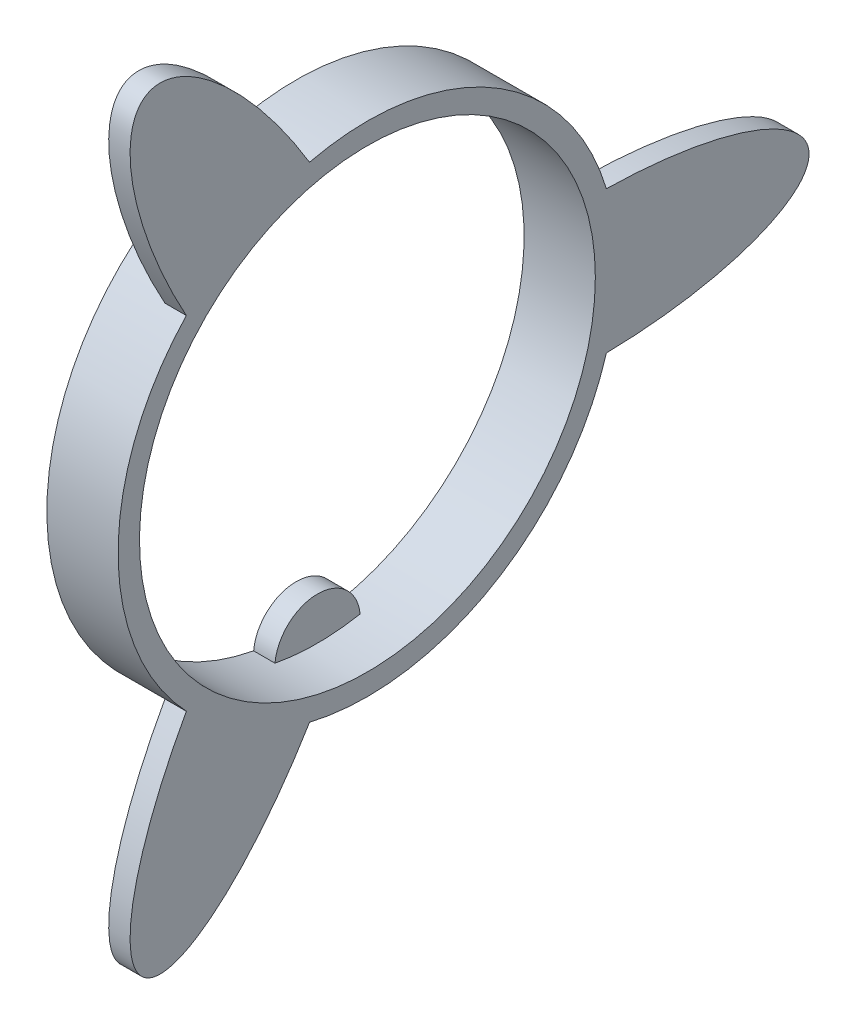
ISO-10303-21;
HEADER;
FILE_DESCRIPTION(('STEP AP214'),'2;1');
FILE_NAME('part.step','',(''),(''),'','','');
FILE_SCHEMA(('AUTOMOTIVE_DESIGN { 1 0 10303 214 1 1 1 1 }'));
ENDSEC;
DATA;
#1=APPLICATION_CONTEXT('core data for automotive mechanical design processes');
#2=APPLICATION_PROTOCOL_DEFINITION('international standard','automotive_design',2000,#1);
#3=PRODUCT_CONTEXT('',#1,'mechanical');
#4=PRODUCT('Part','Part','',(#3));
#5=PRODUCT_RELATED_PRODUCT_CATEGORY('part','',(#4));
#6=PRODUCT_DEFINITION_FORMATION('','',#4);
#7=PRODUCT_DEFINITION_CONTEXT('part definition',#1,'design');
#8=PRODUCT_DEFINITION('design','',#6,#7);
#9=PRODUCT_DEFINITION_SHAPE('','',#8);
#10=(LENGTH_UNIT() NAMED_UNIT(*) SI_UNIT(.MILLI.,.METRE.));
#11=(NAMED_UNIT(*) PLANE_ANGLE_UNIT() SI_UNIT($,.RADIAN.));
#12=(NAMED_UNIT(*) SI_UNIT($,.STERADIAN.) SOLID_ANGLE_UNIT());
#13=UNCERTAINTY_MEASURE_WITH_UNIT(LENGTH_MEASURE(1.E-05),#10,'distance_accuracy_value','');
#14=(GEOMETRIC_REPRESENTATION_CONTEXT(3) GLOBAL_UNCERTAINTY_ASSIGNED_CONTEXT((#13)) GLOBAL_UNIT_ASSIGNED_CONTEXT((#10,
#11,#12)) REPRESENTATION_CONTEXT('',''));
#15=CARTESIAN_POINT('',(0.,0.,0.));
#16=DIRECTION('',(0.,0.,1.));
#17=DIRECTION('',(1.,0.,0.));
#18=AXIS2_PLACEMENT_3D('',#15,#16,#17);
#19=CARTESIAN_POINT('',(5.,0.,0.));
#20=DIRECTION('',(-1.,0.,0.));
#21=DIRECTION('',(0.,0.,1.));
#22=AXIS2_PLACEMENT_3D('',#19,#20,#21);
#23=CYLINDRICAL_SURFACE('',#22,17.5);
#24=CARTESIAN_POINT('',(0.,0.,0.));
#25=DIRECTION('',(1.,0.,0.));
#26=DIRECTION('',(0.,0.,-1.));
#27=AXIS2_PLACEMENT_3D('',#24,#25,#26);
#28=CIRCLE('',#27,17.5);
#29=CARTESIAN_POINT('',(0.,0.,-17.5));
#30=VERTEX_POINT('',#29);
#31=EDGE_CURVE('E138',#30,#30,#28,.T.);
#32=ORIENTED_EDGE('',*,*,#31,.T.);
#33=EDGE_LOOP('',(#32));
#34=FACE_BOUND('',#33,.T.);
#35=CARTESIAN_POINT('',(3.5,0.,0.));
#36=DIRECTION('',(1.,0.,0.));
#37=DIRECTION('',(0.,0.,-1.));
#38=AXIS2_PLACEMENT_3D('',#35,#36,#37);
#39=CIRCLE('',#38,17.5);
#40=CARTESIAN_POINT('',(3.5,-12.0287168054307,12.7106243754879));
#41=VERTEX_POINT('',#40);
#42=CARTESIAN_POINT('',(3.5,-17.0220820098497,4.06186214068753));
#43=VERTEX_POINT('',#42);
#44=EDGE_CURVE('E165',#41,#43,#39,.T.);
#45=ORIENTED_EDGE('',*,*,#44,.F.);
#46=DIRECTION('',(1.,0.,0.));
#47=VECTOR('',#46,1.);
#48=CARTESIAN_POINT('',(3.5,-12.0287168054307,12.7106243754879));
#49=LINE('',#48,#47);
#50=CARTESIAN_POINT('',(5.,-12.0287168054307,12.7106243754879));
#51=VERTEX_POINT('',#50);
#52=EDGE_CURVE('E174',#41,#51,#49,.T.);
#53=ORIENTED_EDGE('',*,*,#52,.T.);
#54=CARTESIAN_POINT('',(5.,0.,0.));
#55=DIRECTION('',(1.,0.,0.));
#56=DIRECTION('',(0.,0.,-1.));
#57=AXIS2_PLACEMENT_3D('',#54,#55,#56);
#58=CIRCLE('',#57,17.5);
#59=CARTESIAN_POINT('',(5.,12.0287168054307,12.7106243754879));
#60=VERTEX_POINT('',#59);
#61=EDGE_CURVE('E143',#60,#51,#58,.T.);
#62=ORIENTED_EDGE('',*,*,#61,.F.);
#63=DIRECTION('',(1.,0.,0.));
#64=VECTOR('',#63,1.);
#65=CARTESIAN_POINT('',(3.5,12.0287168054307,12.7106243754879));
#66=LINE('',#65,#64);
#67=CARTESIAN_POINT('',(3.5,12.0287168054307,12.7106243754879));
#68=VERTEX_POINT('',#67);
#69=EDGE_CURVE('E253',#68,#60,#66,.T.);
#70=ORIENTED_EDGE('',*,*,#69,.F.);
#71=CARTESIAN_POINT('',(3.5,0.,0.));
#72=DIRECTION('',(1.,0.,0.));
#73=DIRECTION('',(0.,0.,-1.));
#74=AXIS2_PLACEMENT_3D('',#71,#72,#73);
#75=CIRCLE('',#74,17.5);
#76=CARTESIAN_POINT('',(3.5,17.0220820098497,4.06186214068754));
#77=VERTEX_POINT('',#76);
#78=EDGE_CURVE('E215',#77,#68,#75,.T.);
#79=ORIENTED_EDGE('',*,*,#78,.F.);
#80=DIRECTION('',(1.,0.,0.));
#81=VECTOR('',#80,1.);
#82=CARTESIAN_POINT('',(3.5,17.0220820098497,4.06186214068754));
#83=LINE('',#82,#81);
#84=CARTESIAN_POINT('',(5.,17.0220820098497,4.06186214068754));
#85=VERTEX_POINT('',#84);
#86=EDGE_CURVE('E140',#77,#85,#83,.T.);
#87=ORIENTED_EDGE('',*,*,#86,.T.);
#88=CARTESIAN_POINT('',(5.,4.99336520441905,-16.7724865161757));
#89=VERTEX_POINT('',#88);
#90=EDGE_CURVE('E147',#89,#85,#58,.T.);
#91=ORIENTED_EDGE('',*,*,#90,.F.);
#92=DIRECTION('',(1.,0.,0.));
#93=VECTOR('',#92,1.);
#94=CARTESIAN_POINT('',(3.5,4.99336520441905,-16.7724865161757));
#95=LINE('',#94,#93);
#96=CARTESIAN_POINT('',(3.5,4.99336520441905,-16.7724865161757));
#97=VERTEX_POINT('',#96);
#98=EDGE_CURVE('E206',#97,#89,#95,.T.);
#99=ORIENTED_EDGE('',*,*,#98,.F.);
#100=CARTESIAN_POINT('',(3.5,0.,0.));
#101=DIRECTION('',(1.,0.,0.));
#102=DIRECTION('',(0.,0.,-1.));
#103=AXIS2_PLACEMENT_3D('',#100,#101,#102);
#104=CIRCLE('',#103,17.5);
#105=CARTESIAN_POINT('',(3.5,-4.99336520441905,-16.7724865161757));
#106=VERTEX_POINT('',#105);
#107=EDGE_CURVE('E201',#106,#97,#104,.T.);
#108=ORIENTED_EDGE('',*,*,#107,.F.);
#109=DIRECTION('',(1.,0.,0.));
#110=VECTOR('',#109,1.);
#111=CARTESIAN_POINT('',(3.5,-4.99336520441905,-16.7724865161757));
#112=LINE('',#111,#110);
#113=CARTESIAN_POINT('',(5.,-4.99336520441905,-16.7724865161757));
#114=VERTEX_POINT('',#113);
#115=EDGE_CURVE('E200',#106,#114,#112,.T.);
#116=ORIENTED_EDGE('',*,*,#115,.T.);
#117=CARTESIAN_POINT('',(5.,-17.0220820098497,4.06186214068753));
#118=VERTEX_POINT('',#117);
#119=EDGE_CURVE('E146',#118,#114,#58,.T.);
#120=ORIENTED_EDGE('',*,*,#119,.F.);
#121=DIRECTION('',(1.,0.,0.));
#122=VECTOR('',#121,1.);
#123=CARTESIAN_POINT('',(3.5,-17.0220820098497,4.06186214068753));
#124=LINE('',#123,#122);
#125=EDGE_CURVE('E205',#43,#118,#124,.T.);
#126=ORIENTED_EDGE('',*,*,#125,.F.);
#127=EDGE_LOOP('',(#45,#53,#62,#70,#79,#87,#91,#99,#108,#116,#120,#126));
#128=FACE_BOUND('',#127,.T.);
#129=ADVANCED_FACE('F40',(#34,#128),#23,.T.);
#130=CARTESIAN_POINT('',(5.,0.,0.));
#131=DIRECTION('',(1.,0.,0.));
#132=DIRECTION('',(0.,0.,-1.));
#133=AXIS2_PLACEMENT_3D('',#130,#131,#132);
#134=PLANE('',#133);
#135=ORIENTED_EDGE('',*,*,#61,.T.);
#136=CARTESIAN_POINT('',(5.,-13.8564064605511,7.99999999999987));
#137=DIRECTION('',(1.,0.,0.));
#138=DIRECTION('',(0.,0.866025403784443,-0.499999999999992));
#139=AXIS2_PLACEMENT_3D('',#136,#137,#138);
#140=ELLIPSE('',#139,15.,5.);
#141=EDGE_CURVE('E62',#51,#118,#140,.T.);
#142=ORIENTED_EDGE('',*,*,#141,.T.);
#143=ORIENTED_EDGE('',*,*,#119,.T.);
#144=CARTESIAN_POINT('',(5.,0.,-16.));
#145=DIRECTION('',(1.,0.,0.));
#146=DIRECTION('',(0.,0.,1.));
#147=AXIS2_PLACEMENT_3D('',#144,#145,#146);
#148=ELLIPSE('',#147,15.,5.);
#149=EDGE_CURVE('E203',#114,#89,#148,.T.);
#150=ORIENTED_EDGE('',*,*,#149,.T.);
#151=ORIENTED_EDGE('',*,*,#90,.T.);
#152=CARTESIAN_POINT('',(5.,13.8564064605511,7.99999999999987));
#153=DIRECTION('',(-1.,0.,0.));
#154=DIRECTION('',(0.,-0.866025403784443,-0.499999999999992));
#155=AXIS2_PLACEMENT_3D('',#152,#153,#154);
#156=ELLIPSE('',#155,15.,5.);
#157=EDGE_CURVE('E209',#60,#85,#156,.T.);
#158=ORIENTED_EDGE('',*,*,#157,.F.);
#159=EDGE_LOOP('',(#135,#142,#143,#150,#151,#158));
#160=FACE_BOUND('',#159,.T.);
#161=CARTESIAN_POINT('',(5.,0.,0.));
#162=DIRECTION('',(1.,0.,0.));
#163=DIRECTION('',(0.,0.,-1.));
#164=AXIS2_PLACEMENT_3D('',#161,#162,#163);
#165=CIRCLE('',#164,16.);
#166=CARTESIAN_POINT('',(5.,0.,-16.));
#167=VERTEX_POINT('',#166);
#168=EDGE_CURVE('E134',#167,#167,#165,.T.);
#169=ORIENTED_EDGE('',*,*,#168,.F.);
#170=EDGE_LOOP('',(#169));
#171=FACE_BOUND('',#170,.T.);
#172=ADVANCED_FACE('F223',(#160,#171),#134,.T.);
#173=CARTESIAN_POINT('',(0.,0.,0.));
#174=DIRECTION('',(1.,0.,0.));
#175=DIRECTION('',(0.,0.,-1.));
#176=AXIS2_PLACEMENT_3D('',#173,#174,#175);
#177=PLANE('',#176);
#178=CARTESIAN_POINT('',(0.,-16.,0.));
#179=DIRECTION('',(-1.,0.,0.));
#180=DIRECTION('',(0.,0.,1.));
#181=AXIS2_PLACEMENT_3D('',#178,#179,#180);
#182=CIRCLE('',#181,3.);
#183=CARTESIAN_POINT('',(0.,-15.71875,2.98678731038887));
#184=VERTEX_POINT('',#183);
#185=CARTESIAN_POINT('',(0.,-15.71875,-2.98678731038887));
#186=VERTEX_POINT('',#185);
#187=EDGE_CURVE('E115',#184,#186,#182,.T.);
#188=ORIENTED_EDGE('',*,*,#187,.T.);
#189=CARTESIAN_POINT('',(0.,0.,0.));
#190=DIRECTION('',(1.,0.,0.));
#191=DIRECTION('',(0.,0.,-1.));
#192=AXIS2_PLACEMENT_3D('',#189,#190,#191);
#193=CIRCLE('',#192,16.);
#194=CARTESIAN_POINT('',(0.,15.71875,-2.98678731038887));
#195=VERTEX_POINT('',#194);
#196=EDGE_CURVE('E135',#186,#195,#193,.T.);
#197=ORIENTED_EDGE('',*,*,#196,.T.);
#198=CARTESIAN_POINT('',(0.,16.,0.));
#199=DIRECTION('',(-1.,0.,0.));
#200=DIRECTION('',(0.,0.,-1.));
#201=AXIS2_PLACEMENT_3D('',#198,#199,#200);
#202=CIRCLE('',#201,3.);
#203=CARTESIAN_POINT('',(0.,15.71875,2.98678731038887));
#204=VERTEX_POINT('',#203);
#205=EDGE_CURVE('E54',#195,#204,#202,.T.);
#206=ORIENTED_EDGE('',*,*,#205,.T.);
#207=EDGE_CURVE('E130',#204,#184,#193,.T.);
#208=ORIENTED_EDGE('',*,*,#207,.T.);
#209=EDGE_LOOP('',(#188,#197,#206,#208));
#210=FACE_BOUND('',#209,.T.);
#211=ORIENTED_EDGE('',*,*,#31,.F.);
#212=EDGE_LOOP('',(#211));
#213=FACE_BOUND('',#212,.T.);
#214=ADVANCED_FACE('F132',(#210,#213),#177,.F.);
#215=CARTESIAN_POINT('',(5.,0.,0.));
#216=DIRECTION('',(-1.,0.,0.));
#217=DIRECTION('',(0.,0.,1.));
#218=AXIS2_PLACEMENT_3D('',#215,#216,#217);
#219=CYLINDRICAL_SURFACE('',#218,16.);
#220=DIRECTION('',(-1.,0.,0.));
#221=VECTOR('',#220,1.);
#222=CARTESIAN_POINT('',(0.75,-15.71875,2.98678731038887));
#223=LINE('',#222,#221);
#224=CARTESIAN_POINT('',(1.5,-15.71875,2.98678731038887));
#225=VERTEX_POINT('',#224);
#226=EDGE_CURVE('E11',#184,#225,#223,.F.);
#227=ORIENTED_EDGE('',*,*,#226,.F.);
#228=ORIENTED_EDGE('',*,*,#207,.F.);
#229=DIRECTION('',(-1.,0.,0.));
#230=VECTOR('',#229,1.);
#231=CARTESIAN_POINT('',(0.75,15.71875,2.98678731038887));
#232=LINE('',#231,#230);
#233=CARTESIAN_POINT('',(1.5,15.71875,2.98678731038887));
#234=VERTEX_POINT('',#233);
#235=EDGE_CURVE('E151',#234,#204,#232,.T.);
#236=ORIENTED_EDGE('',*,*,#235,.F.);
#237=CARTESIAN_POINT('',(1.5,0.,0.));
#238=DIRECTION('',(1.,0.,0.));
#239=DIRECTION('',(0.,0.,-1.));
#240=AXIS2_PLACEMENT_3D('',#237,#238,#239);
#241=CIRCLE('',#240,16.);
#242=CARTESIAN_POINT('',(1.5,15.71875,-2.98678731038887));
#243=VERTEX_POINT('',#242);
#244=EDGE_CURVE('E145',#243,#234,#241,.T.);
#245=ORIENTED_EDGE('',*,*,#244,.F.);
#246=DIRECTION('',(-1.,0.,0.));
#247=VECTOR('',#246,1.);
#248=CARTESIAN_POINT('',(0.75,15.71875,-2.98678731038887));
#249=LINE('',#248,#247);
#250=EDGE_CURVE('E153',#195,#243,#249,.F.);
#251=ORIENTED_EDGE('',*,*,#250,.F.);
#252=ORIENTED_EDGE('',*,*,#196,.F.);
#253=DIRECTION('',(-1.,0.,0.));
#254=VECTOR('',#253,1.);
#255=CARTESIAN_POINT('',(0.75,-15.71875,-2.98678731038887));
#256=LINE('',#255,#254);
#257=CARTESIAN_POINT('',(1.5,-15.71875,-2.98678731038887));
#258=VERTEX_POINT('',#257);
#259=EDGE_CURVE('E47',#258,#186,#256,.T.);
#260=ORIENTED_EDGE('',*,*,#259,.F.);
#261=CARTESIAN_POINT('',(1.5,0.,0.));
#262=DIRECTION('',(-1.,0.,0.));
#263=DIRECTION('',(0.,0.,1.));
#264=AXIS2_PLACEMENT_3D('',#261,#262,#263);
#265=CIRCLE('',#264,16.);
#266=EDGE_CURVE('E131',#258,#225,#265,.T.);
#267=ORIENTED_EDGE('',*,*,#266,.T.);
#268=EDGE_LOOP('',(#227,#228,#236,#245,#251,#252,#260,#267));
#269=FACE_BOUND('',#268,.T.);
#270=ORIENTED_EDGE('',*,*,#168,.T.);
#271=EDGE_LOOP('',(#270));
#272=FACE_BOUND('',#271,.T.);
#273=ADVANCED_FACE('F127',(#269,#272),#219,.F.);
#274=CARTESIAN_POINT('',(3.5,13.8564064605511,7.99999999999987));
#275=DIRECTION('',(-1.,0.,0.));
#276=DIRECTION('',(0.,-0.866025403784443,-0.499999999999992));
#277=AXIS2_PLACEMENT_3D('',#274,#275,#276);
#278=ELLIPSE('',#277,15.,5.);
#279=DIRECTION('',(1.,0.,0.));
#280=VECTOR('',#279,1.);
#281=SURFACE_OF_LINEAR_EXTRUSION('',#278,#280);
#282=ORIENTED_EDGE('',*,*,#157,.T.);
#283=ORIENTED_EDGE('',*,*,#86,.F.);
#284=EDGE_CURVE('E212',#68,#77,#278,.T.);
#285=ORIENTED_EDGE('',*,*,#284,.F.);
#286=ORIENTED_EDGE('',*,*,#69,.T.);
#287=EDGE_LOOP('',(#282,#283,#285,#286));
#288=FACE_BOUND('',#287,.T.);
#289=ADVANCED_FACE('F217',(#288),#281,.F.);
#290=CARTESIAN_POINT('',(3.5,0.,0.));
#291=DIRECTION('',(1.,0.,0.));
#292=DIRECTION('',(0.,0.,-1.));
#293=AXIS2_PLACEMENT_3D('',#290,#291,#292);
#294=PLANE('',#293);
#295=ORIENTED_EDGE('',*,*,#284,.T.);
#296=ORIENTED_EDGE('',*,*,#78,.T.);
#297=EDGE_LOOP('',(#295,#296));
#298=FACE_BOUND('',#297,.T.);
#299=ADVANCED_FACE('F192',(#298),#294,.F.);
#300=CARTESIAN_POINT('',(3.5,0.,-16.));
#301=DIRECTION('',(1.,0.,0.));
#302=DIRECTION('',(0.,0.,1.));
#303=AXIS2_PLACEMENT_3D('',#300,#301,#302);
#304=ELLIPSE('',#303,15.,5.);
#305=DIRECTION('',(1.,0.,0.));
#306=VECTOR('',#305,1.);
#307=SURFACE_OF_LINEAR_EXTRUSION('',#304,#306);
#308=ORIENTED_EDGE('',*,*,#149,.F.);
#309=ORIENTED_EDGE('',*,*,#115,.F.);
#310=EDGE_CURVE('E195',#106,#97,#304,.T.);
#311=ORIENTED_EDGE('',*,*,#310,.T.);
#312=ORIENTED_EDGE('',*,*,#98,.T.);
#313=EDGE_LOOP('',(#308,#309,#311,#312));
#314=FACE_BOUND('',#313,.T.);
#315=ADVANCED_FACE('F187',(#314),#307,.T.);
#316=CARTESIAN_POINT('',(3.5,0.,0.));
#317=DIRECTION('',(1.,0.,0.));
#318=DIRECTION('',(0.,0.,-1.));
#319=AXIS2_PLACEMENT_3D('',#316,#317,#318);
#320=PLANE('',#319);
#321=ORIENTED_EDGE('',*,*,#107,.T.);
#322=ORIENTED_EDGE('',*,*,#310,.F.);
#323=EDGE_LOOP('',(#321,#322));
#324=FACE_BOUND('',#323,.T.);
#325=ADVANCED_FACE('F182',(#324),#320,.F.);
#326=CARTESIAN_POINT('',(3.5,-13.8564064605511,7.99999999999987));
#327=DIRECTION('',(1.,0.,0.));
#328=DIRECTION('',(0.,0.866025403784443,-0.499999999999992));
#329=AXIS2_PLACEMENT_3D('',#326,#327,#328);
#330=ELLIPSE('',#329,15.,5.);
#331=DIRECTION('',(1.,0.,0.));
#332=VECTOR('',#331,1.);
#333=SURFACE_OF_LINEAR_EXTRUSION('',#330,#332);
#334=ORIENTED_EDGE('',*,*,#141,.F.);
#335=ORIENTED_EDGE('',*,*,#52,.F.);
#336=EDGE_CURVE('E171',#41,#43,#330,.T.);
#337=ORIENTED_EDGE('',*,*,#336,.T.);
#338=ORIENTED_EDGE('',*,*,#125,.T.);
#339=EDGE_LOOP('',(#334,#335,#337,#338));
#340=FACE_BOUND('',#339,.T.);
#341=ADVANCED_FACE('F177',(#340),#333,.T.);
#342=CARTESIAN_POINT('',(3.5,0.,0.));
#343=DIRECTION('',(1.,0.,0.));
#344=DIRECTION('',(0.,0.,-1.));
#345=AXIS2_PLACEMENT_3D('',#342,#343,#344);
#346=PLANE('',#345);
#347=ORIENTED_EDGE('',*,*,#44,.T.);
#348=ORIENTED_EDGE('',*,*,#336,.F.);
#349=EDGE_LOOP('',(#347,#348));
#350=FACE_BOUND('',#349,.T.);
#351=ADVANCED_FACE('F181',(#350),#346,.F.);
#352=CARTESIAN_POINT('',(1.5,16.,0.));
#353=DIRECTION('',(1.,0.,0.));
#354=DIRECTION('',(0.,0.,-1.));
#355=AXIS2_PLACEMENT_3D('',#352,#353,#354);
#356=PLANE('',#355);
#357=CARTESIAN_POINT('',(1.5,16.,0.));
#358=DIRECTION('',(-1.,0.,0.));
#359=DIRECTION('',(0.,0.,-1.));
#360=AXIS2_PLACEMENT_3D('',#357,#358,#359);
#361=CIRCLE('',#360,3.);
#362=EDGE_CURVE('E161',#243,#234,#361,.T.);
#363=ORIENTED_EDGE('',*,*,#362,.F.);
#364=ORIENTED_EDGE('',*,*,#244,.T.);
#365=EDGE_LOOP('',(#363,#364));
#366=FACE_BOUND('',#365,.T.);
#367=ADVANCED_FACE('F163',(#366),#356,.T.);
#368=CARTESIAN_POINT('',(1.5,16.,0.));
#369=DIRECTION('',(-1.,0.,0.));
#370=DIRECTION('',(0.,0.,1.));
#371=AXIS2_PLACEMENT_3D('',#368,#369,#370);
#372=CYLINDRICAL_SURFACE('',#371,3.);
#373=ORIENTED_EDGE('',*,*,#205,.F.);
#374=ORIENTED_EDGE('',*,*,#250,.T.);
#375=ORIENTED_EDGE('',*,*,#362,.T.);
#376=ORIENTED_EDGE('',*,*,#235,.T.);
#377=EDGE_LOOP('',(#373,#374,#375,#376));
#378=FACE_BOUND('',#377,.T.);
#379=ADVANCED_FACE('F160',(#378),#372,.T.);
#380=CARTESIAN_POINT('',(1.5,-16.,0.));
#381=DIRECTION('',(-1.,0.,0.));
#382=DIRECTION('',(0.,0.,1.));
#383=AXIS2_PLACEMENT_3D('',#380,#381,#382);
#384=PLANE('',#383);
#385=ORIENTED_EDGE('',*,*,#266,.F.);
#386=CARTESIAN_POINT('',(1.5,-16.,0.));
#387=DIRECTION('',(-1.,0.,0.));
#388=DIRECTION('',(0.,0.,1.));
#389=AXIS2_PLACEMENT_3D('',#386,#387,#388);
#390=CIRCLE('',#389,3.);
#391=EDGE_CURVE('E122',#225,#258,#390,.T.);
#392=ORIENTED_EDGE('',*,*,#391,.F.);
#393=EDGE_LOOP('',(#385,#392));
#394=FACE_BOUND('',#393,.T.);
#395=ADVANCED_FACE('F291',(#394),#384,.F.);
#396=CARTESIAN_POINT('',(1.5,-16.,0.));
#397=DIRECTION('',(-1.,0.,0.));
#398=DIRECTION('',(0.,0.,1.));
#399=AXIS2_PLACEMENT_3D('',#396,#397,#398);
#400=CYLINDRICAL_SURFACE('',#399,3.);
#401=ORIENTED_EDGE('',*,*,#187,.F.);
#402=ORIENTED_EDGE('',*,*,#226,.T.);
#403=ORIENTED_EDGE('',*,*,#391,.T.);
#404=ORIENTED_EDGE('',*,*,#259,.T.);
#405=EDGE_LOOP('',(#401,#402,#403,#404));
#406=FACE_BOUND('',#405,.T.);
#407=ADVANCED_FACE('F117',(#406),#400,.T.);
#408=CLOSED_SHELL('',(#129,#172,#214,#273,#289,#299,#315,#325,#341,#351,#367,#379,#395,#407));
#409=MANIFOLD_SOLID_BREP('B2',#408);
#410=ADVANCED_BREP_SHAPE_REPRESENTATION('',(#18,#409),#14);
#411=SHAPE_DEFINITION_REPRESENTATION(#9,#410);
ENDSEC;
END-ISO-10303-21;
